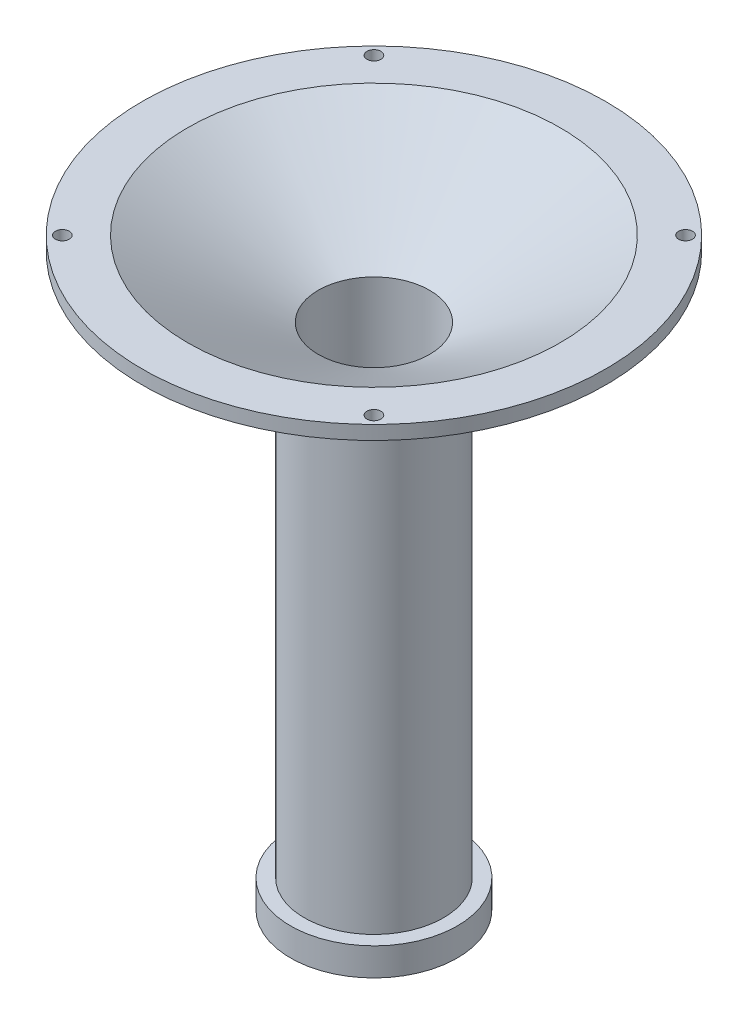
ISO-10303-21;
HEADER;
FILE_DESCRIPTION(('STEP AP214'),'2;1');
FILE_NAME('part.step','',(''),(''),'','','');
FILE_SCHEMA(('AUTOMOTIVE_DESIGN { 1 0 10303 214 1 1 1 1 }'));
ENDSEC;
DATA;
#1=APPLICATION_CONTEXT('core data for automotive mechanical design processes');
#2=APPLICATION_PROTOCOL_DEFINITION('international standard','automotive_design',2000,#1);
#3=PRODUCT_CONTEXT('',#1,'mechanical');
#4=PRODUCT('Part','Part','',(#3));
#5=PRODUCT_RELATED_PRODUCT_CATEGORY('part','',(#4));
#6=PRODUCT_DEFINITION_FORMATION('','',#4);
#7=PRODUCT_DEFINITION_CONTEXT('part definition',#1,'design');
#8=PRODUCT_DEFINITION('design','',#6,#7);
#9=PRODUCT_DEFINITION_SHAPE('','',#8);
#10=(LENGTH_UNIT() NAMED_UNIT(*) SI_UNIT(.MILLI.,.METRE.));
#11=(NAMED_UNIT(*) PLANE_ANGLE_UNIT() SI_UNIT($,.RADIAN.));
#12=(NAMED_UNIT(*) SI_UNIT($,.STERADIAN.) SOLID_ANGLE_UNIT());
#13=UNCERTAINTY_MEASURE_WITH_UNIT(LENGTH_MEASURE(1.E-05),#10,'distance_accuracy_value','');
#14=(GEOMETRIC_REPRESENTATION_CONTEXT(3) GLOBAL_UNCERTAINTY_ASSIGNED_CONTEXT((#13)) GLOBAL_UNIT_ASSIGNED_CONTEXT((#10,
#11,#12)) REPRESENTATION_CONTEXT('',''));
#15=CARTESIAN_POINT('',(0.,0.,0.));
#16=DIRECTION('',(0.,0.,1.));
#17=DIRECTION('',(1.,0.,0.));
#18=AXIS2_PLACEMENT_3D('',#15,#16,#17);
#19=CARTESIAN_POINT('',(0.,0.,0.));
#20=DIRECTION('',(0.,-1.,0.));
#21=DIRECTION('',(0.,0.,-1.));
#22=AXIS2_PLACEMENT_3D('',#19,#20,#21);
#23=CYLINDRICAL_SURFACE('',#22,20.);
#24=CARTESIAN_POINT('',(0.,-121.747729767954,0.));
#25=DIRECTION('',(0.,-1.,0.));
#26=DIRECTION('',(0.,0.,-1.));
#27=AXIS2_PLACEMENT_3D('',#24,#25,#26);
#28=CIRCLE('',#27,20.);
#29=CARTESIAN_POINT('',(0.,-121.747729767954,-20.));
#30=VERTEX_POINT('',#29);
#31=EDGE_CURVE('E10',#30,#30,#28,.T.);
#32=ORIENTED_EDGE('',*,*,#31,.T.);
#33=EDGE_LOOP('',(#32));
#34=FACE_BOUND('',#33,.T.);
#35=CARTESIAN_POINT('',(0.,61.1390215779937,0.));
#36=DIRECTION('',(0.,-1.,0.));
#37=DIRECTION('',(0.,0.,-1.));
#38=AXIS2_PLACEMENT_3D('',#35,#36,#37);
#39=CIRCLE('',#38,20.);
#40=CARTESIAN_POINT('',(0.,61.1390215779937,20.));
#41=VERTEX_POINT('',#40);
#42=EDGE_CURVE('E39',#41,#41,#39,.T.);
#43=ORIENTED_EDGE('',*,*,#42,.F.);
#44=EDGE_LOOP('',(#43));
#45=FACE_BOUND('',#44,.T.);
#46=ADVANCED_FACE('F33',(#34,#45),#23,.F.);
#47=CARTESIAN_POINT('',(0.,88.2522702320456,0.));
#48=DIRECTION('',(0.,1.,0.));
#49=DIRECTION('',(0.,0.,1.));
#50=AXIS2_PLACEMENT_3D('',#47,#48,#49);
#51=CONICAL_SURFACE('',#50,66.9615242270664,1.0471975511966);
#52=CARTESIAN_POINT('',(0.,88.2522702320456,0.));
#53=DIRECTION('',(0.,-1.,0.));
#54=DIRECTION('',(0.,0.,-1.));
#55=AXIS2_PLACEMENT_3D('',#52,#53,#54);
#56=CIRCLE('',#55,66.9615242270664);
#57=CARTESIAN_POINT('',(0.,88.2522702320456,66.9615242270665));
#58=VERTEX_POINT('',#57);
#59=EDGE_CURVE('E43',#58,#58,#56,.T.);
#60=CARTESIAN_POINT('',(0.,61.1390215779937,20.));
#61=CARTESIAN_POINT('',(0.,61.4214512514734,20.4891825440319));
#62=CARTESIAN_POINT('',(0.,61.7038809249532,20.9783650880639));
#63=CARTESIAN_POINT('',(0.,62.2687402719126,21.9567301761278));
#64=CARTESIAN_POINT('',(0.,62.5511699453923,22.4459127201597));
#65=CARTESIAN_POINT('',(0.,63.1160292923517,23.4242778082236));
#66=CARTESIAN_POINT('',(0.,63.3984589658314,23.9134603522555));
#67=CARTESIAN_POINT('',(0.,63.9633183127908,24.8918254403194));
#68=CARTESIAN_POINT('',(0.,64.2457479862705,25.3810079843514));
#69=CARTESIAN_POINT('',(0.,64.8106073332299,26.3593730724152));
#70=CARTESIAN_POINT('',(0.,65.0930370067096,26.8485556164472));
#71=CARTESIAN_POINT('',(0.,65.657896353669,27.8269207045111));
#72=CARTESIAN_POINT('',(0.,65.9403260271488,28.316103248543));
#73=CARTESIAN_POINT('',(0.,66.5051853741082,29.2944683366069));
#74=CARTESIAN_POINT('',(0.,66.7876150475879,29.7836508806388));
#75=CARTESIAN_POINT('',(0.,67.3524743945473,30.7620159687027));
#76=CARTESIAN_POINT('',(0.,67.634904068027,31.2511985127347));
#77=CARTESIAN_POINT('',(0.,68.1997634149864,32.2295636007985));
#78=CARTESIAN_POINT('',(0.,68.4821930884661,32.7187461448305));
#79=CARTESIAN_POINT('',(0.,69.0470524354255,33.6971112328944));
#80=CARTESIAN_POINT('',(0.,69.3294821089052,34.1862937769263));
#81=CARTESIAN_POINT('',(0.,69.8943414558646,35.1646588649902));
#82=CARTESIAN_POINT('',(0.,70.1767711293444,35.6538414090221));
#83=CARTESIAN_POINT('',(0.,70.7416304763038,36.632206497086));
#84=CARTESIAN_POINT('',(0.,71.0240601497835,37.121389041118));
#85=CARTESIAN_POINT('',(0.,71.5889194967429,38.0997541291819));
#86=CARTESIAN_POINT('',(0.,71.8713491702226,38.5889366732138));
#87=CARTESIAN_POINT('',(0.,72.436208517182,39.5673017612777));
#88=CARTESIAN_POINT('',(0.,72.7186381906617,40.0564843053096));
#89=CARTESIAN_POINT('',(0.,73.2834975376211,41.0348493933735));
#90=CARTESIAN_POINT('',(0.,73.5659272111008,41.5240319374055));
#91=CARTESIAN_POINT('',(0.,74.1307865580603,42.5023970254693));
#92=CARTESIAN_POINT('',(0.,74.41321623154,42.9915795695013));
#93=CARTESIAN_POINT('',(0.,74.9780755784994,43.9699446575652));
#94=CARTESIAN_POINT('',(0.,75.2605052519791,44.4591272015971));
#95=CARTESIAN_POINT('',(0.,75.8253645989385,45.437492289661));
#96=CARTESIAN_POINT('',(0.,76.1077942724182,45.9266748336929));
#97=CARTESIAN_POINT('',(0.,76.6726536193776,46.9050399217568));
#98=CARTESIAN_POINT('',(0.,76.9550832928573,47.3942224657888));
#99=CARTESIAN_POINT('',(0.,77.5199426398167,48.3725875538526));
#100=CARTESIAN_POINT('',(0.,77.8023723132965,48.8617700978846));
#101=CARTESIAN_POINT('',(0.,78.3672316602559,49.8401351859485));
#102=CARTESIAN_POINT('',(0.,78.6496613337356,50.3293177299804));
#103=CARTESIAN_POINT('',(0.,79.214520680695,51.3076828180443));
#104=CARTESIAN_POINT('',(0.,79.4969503541747,51.7968653620762));
#105=CARTESIAN_POINT('',(0.,80.0618097011341,52.7752304501401));
#106=CARTESIAN_POINT('',(0.,80.3442393746138,53.2644129941721));
#107=CARTESIAN_POINT('',(0.,80.9090987215732,54.242778082236));
#108=CARTESIAN_POINT('',(0.,81.1915283950529,54.7319606262679));
#109=CARTESIAN_POINT('',(0.,81.7563877420123,55.7103257143318));
#110=CARTESIAN_POINT('',(0.,82.0388174154921,56.1995082583637));
#111=CARTESIAN_POINT('',(0.,82.6036767624515,57.1778733464276));
#112=CARTESIAN_POINT('',(0.,82.8861064359312,57.6670558904596));
#113=CARTESIAN_POINT('',(0.,83.4509657828906,58.6454209785234));
#114=CARTESIAN_POINT('',(0.,83.7333954563703,59.1346035225554));
#115=CARTESIAN_POINT('',(0.,84.2982548033297,60.1129686106193));
#116=CARTESIAN_POINT('',(0.,84.5806844768094,60.6021511546512));
#117=CARTESIAN_POINT('',(0.,85.1455438237688,61.5805162427151));
#118=CARTESIAN_POINT('',(0.,85.4279734972485,62.069698786747));
#119=CARTESIAN_POINT('',(0.,85.9928328442079,63.0480638748109));
#120=CARTESIAN_POINT('',(0.,86.2752625176877,63.5372464188429));
#121=CARTESIAN_POINT('',(0.,86.8401218646471,64.5156115069067));
#122=CARTESIAN_POINT('',(0.,87.1225515381268,65.0047940509387));
#123=CARTESIAN_POINT('',(0.,87.6874108850862,65.9831591390026));
#124=CARTESIAN_POINT('',(0.,87.9698405585659,66.4723416830345));
#125=CARTESIAN_POINT('',(0.,88.2522702320456,66.9615242270665));
#126=B_SPLINE_CURVE_WITH_KNOTS('',3,(#60,#61,#62,#63,#64,#65,#66,#67,#68,#69,#70,#71,#72,#73,
#74,#75,#76,#77,#78,#79,#80,#81,#82,#83,#84,#85,#86,#87,#88,#89,#90,#91,#92,#93,#94,#95,#96,#97,
#98,#99,#100,#101,#102,#103,#104,#105,#106,#107,#108,#109,#110,#111,#112,#113,#114,#115,#116,
#117,#118,#119,#120,#121,#122,#123,#124,#125),.UNSPECIFIED.,.F.,.F.,(4,2,2,2,2,2,2,2,2,2,2,2,2,
2,2,2,2,2,2,2,2,2,2,2,2,2,2,2,2,2,2,2,4),(0.,1.69457804087824,3.38915608175649,5.08373412263473,
6.77831216351297,8.47289020439123,10.1674682452695,11.8620462861477,13.556624327026,
15.2512023679042,16.9457804087825,18.6403584496607,20.334936490539,22.0295145314172,
23.7240925722954,25.4186706131737,27.1132486540519,28.8078266949302,30.5024047358084,
32.1969827766867,33.8915608175649,35.5861388584432,37.2807168993214,38.9752949401996,
40.6698729810779,42.3644510219561,44.0590290628344,45.7536071037126,47.4481851445909,
49.1427631854691,50.8373412263474,52.5319192672256,54.2264973081039),.UNSPECIFIED.);
#127=EDGE_CURVE('BSEAM101',#41,#58,#126,.T.);
#128=ORIENTED_EDGE('',*,*,#42,.T.);
#129=ORIENTED_EDGE('',*,*,#59,.F.);
#130=ORIENTED_EDGE('',*,*,#127,.T.);
#131=ORIENTED_EDGE('',*,*,#127,.F.);
#132=EDGE_LOOP('',(#128,#130,#129,#131));
#133=FACE_BOUND('',#132,.T.);
#134=ADVANCED_FACE('F101',(#133),#51,.F.);
#135=CARTESIAN_POINT('',(83.3012701892221,88.2522702320456,0.));
#136=DIRECTION('',(0.,1.,0.));
#137=DIRECTION('',(0.,0.,1.));
#138=AXIS2_PLACEMENT_3D('',#135,#136,#137);
#139=PLANE('',#138);
#140=CARTESIAN_POINT('',(-56.,88.2522702320456,-56.));
#141=DIRECTION('',(0.,1.,0.));
#142=DIRECTION('',(0.,0.,1.));
#143=AXIS2_PLACEMENT_3D('',#140,#141,#142);
#144=CIRCLE('',#143,2.49999999999999);
#145=CARTESIAN_POINT('',(-56.,88.2522702320456,-53.5));
#146=VERTEX_POINT('',#145);
#147=EDGE_CURVE('E91',#146,#146,#144,.T.);
#148=ORIENTED_EDGE('',*,*,#147,.F.);
#149=EDGE_LOOP('',(#148));
#150=FACE_BOUND('',#149,.T.);
#151=CARTESIAN_POINT('',(56.,88.2522702320456,-56.));
#152=DIRECTION('',(0.,1.,0.));
#153=DIRECTION('',(0.,0.,1.));
#154=AXIS2_PLACEMENT_3D('',#151,#152,#153);
#155=CIRCLE('',#154,2.49999999999999);
#156=CARTESIAN_POINT('',(56.,88.2522702320456,-53.5));
#157=VERTEX_POINT('',#156);
#158=EDGE_CURVE('E85',#157,#157,#155,.T.);
#159=ORIENTED_EDGE('',*,*,#158,.F.);
#160=EDGE_LOOP('',(#159));
#161=FACE_BOUND('',#160,.T.);
#162=CARTESIAN_POINT('',(-56.,88.2522702320456,56.));
#163=DIRECTION('',(0.,1.,0.));
#164=DIRECTION('',(0.,0.,1.));
#165=AXIS2_PLACEMENT_3D('',#162,#163,#164);
#166=CIRCLE('',#165,2.49999999999999);
#167=CARTESIAN_POINT('',(-56.,88.2522702320456,58.5));
#168=VERTEX_POINT('',#167);
#169=EDGE_CURVE('E79',#168,#168,#166,.T.);
#170=ORIENTED_EDGE('',*,*,#169,.F.);
#171=EDGE_LOOP('',(#170));
#172=FACE_BOUND('',#171,.T.);
#173=CARTESIAN_POINT('',(56.,88.2522702320456,56.));
#174=DIRECTION('',(0.,1.,0.));
#175=DIRECTION('',(0.,0.,1.));
#176=AXIS2_PLACEMENT_3D('',#173,#174,#175);
#177=CIRCLE('',#176,2.49999999999999);
#178=CARTESIAN_POINT('',(56.,88.2522702320456,58.5));
#179=VERTEX_POINT('',#178);
#180=EDGE_CURVE('E73',#179,#179,#177,.T.);
#181=ORIENTED_EDGE('',*,*,#180,.F.);
#182=EDGE_LOOP('',(#181));
#183=FACE_BOUND('',#182,.T.);
#184=ORIENTED_EDGE('',*,*,#59,.T.);
#185=EDGE_LOOP('',(#184));
#186=FACE_BOUND('',#185,.T.);
#187=CARTESIAN_POINT('',(0.,88.2522702320456,0.));
#188=DIRECTION('',(0.,-1.,0.));
#189=DIRECTION('',(0.,0.,-1.));
#190=AXIS2_PLACEMENT_3D('',#187,#188,#189);
#191=CIRCLE('',#190,83.3012701892221);
#192=CARTESIAN_POINT('',(0.,88.2522702320456,-83.3012701892221));
#193=VERTEX_POINT('',#192);
#194=EDGE_CURVE('E47',#193,#193,#191,.T.);
#195=ORIENTED_EDGE('',*,*,#194,.F.);
#196=EDGE_LOOP('',(#195));
#197=FACE_BOUND('',#196,.T.);
#198=ADVANCED_FACE('F97',(#150,#161,#172,#183,#186,#197),#139,.T.);
#199=CARTESIAN_POINT('',(0.,0.,0.));
#200=DIRECTION('',(0.,-1.,0.));
#201=DIRECTION('',(0.,0.,-1.));
#202=AXIS2_PLACEMENT_3D('',#199,#200,#201);
#203=CYLINDRICAL_SURFACE('',#202,83.3012701892221);
#204=ORIENTED_EDGE('',*,*,#194,.T.);
#205=EDGE_LOOP('',(#204));
#206=FACE_BOUND('',#205,.T.);
#207=CARTESIAN_POINT('',(0.,83.2522702320456,0.));
#208=DIRECTION('',(0.,-1.,0.));
#209=DIRECTION('',(0.,0.,-1.));
#210=AXIS2_PLACEMENT_3D('',#207,#208,#209);
#211=CIRCLE('',#210,83.3012701892221);
#212=CARTESIAN_POINT('',(0.,83.2522702320456,-83.3012701892221));
#213=VERTEX_POINT('',#212);
#214=EDGE_CURVE('E52',#213,#213,#211,.T.);
#215=ORIENTED_EDGE('',*,*,#214,.F.);
#216=EDGE_LOOP('',(#215));
#217=FACE_BOUND('',#216,.T.);
#218=ADVANCED_FACE('F100',(#206,#217),#203,.T.);
#219=CARTESIAN_POINT('',(68.3012701892221,83.2522702320456,0.));
#220=DIRECTION('',(0.,-1.,0.));
#221=DIRECTION('',(0.,0.,-1.));
#222=AXIS2_PLACEMENT_3D('',#219,#220,#221);
#223=PLANE('',#222);
#224=CARTESIAN_POINT('',(-56.,83.2522702320456,-56.));
#225=DIRECTION('',(0.,-1.,0.));
#226=DIRECTION('',(0.,0.,-1.));
#227=AXIS2_PLACEMENT_3D('',#224,#225,#226);
#228=CIRCLE('',#227,2.49999999999997);
#229=CARTESIAN_POINT('',(-56.,83.2522702320456,-58.5));
#230=VERTEX_POINT('',#229);
#231=EDGE_CURVE('E88',#230,#230,#228,.T.);
#232=ORIENTED_EDGE('',*,*,#231,.F.);
#233=EDGE_LOOP('',(#232));
#234=FACE_BOUND('',#233,.T.);
#235=CARTESIAN_POINT('',(56.,83.2522702320456,-56.));
#236=DIRECTION('',(0.,-1.,0.));
#237=DIRECTION('',(0.,0.,-1.));
#238=AXIS2_PLACEMENT_3D('',#235,#236,#237);
#239=CIRCLE('',#238,2.49999999999997);
#240=CARTESIAN_POINT('',(56.,83.2522702320456,-58.5));
#241=VERTEX_POINT('',#240);
#242=EDGE_CURVE('E82',#241,#241,#239,.T.);
#243=ORIENTED_EDGE('',*,*,#242,.F.);
#244=EDGE_LOOP('',(#243));
#245=FACE_BOUND('',#244,.T.);
#246=CARTESIAN_POINT('',(-56.,83.2522702320456,56.));
#247=DIRECTION('',(0.,-1.,0.));
#248=DIRECTION('',(0.,0.,-1.));
#249=AXIS2_PLACEMENT_3D('',#246,#247,#248);
#250=CIRCLE('',#249,2.49999999999997);
#251=CARTESIAN_POINT('',(-56.,83.2522702320456,53.5));
#252=VERTEX_POINT('',#251);
#253=EDGE_CURVE('E76',#252,#252,#250,.T.);
#254=ORIENTED_EDGE('',*,*,#253,.F.);
#255=EDGE_LOOP('',(#254));
#256=FACE_BOUND('',#255,.T.);
#257=CARTESIAN_POINT('',(56.,83.2522702320456,56.));
#258=DIRECTION('',(0.,-1.,0.));
#259=DIRECTION('',(0.,0.,-1.));
#260=AXIS2_PLACEMENT_3D('',#257,#258,#259);
#261=CIRCLE('',#260,2.49999999999997);
#262=CARTESIAN_POINT('',(56.,83.2522702320456,53.5));
#263=VERTEX_POINT('',#262);
#264=EDGE_CURVE('E70',#263,#263,#261,.T.);
#265=ORIENTED_EDGE('',*,*,#264,.F.);
#266=EDGE_LOOP('',(#265));
#267=FACE_BOUND('',#266,.T.);
#268=ORIENTED_EDGE('',*,*,#214,.T.);
#269=EDGE_LOOP('',(#268));
#270=FACE_BOUND('',#269,.T.);
#271=CARTESIAN_POINT('',(0.,83.2522702320456,0.));
#272=DIRECTION('',(0.,-1.,0.));
#273=DIRECTION('',(0.,0.,-1.));
#274=AXIS2_PLACEMENT_3D('',#271,#272,#273);
#275=CIRCLE('',#274,68.3012701892221);
#276=CARTESIAN_POINT('',(0.,83.2522702320456,-68.3012701892221));
#277=VERTEX_POINT('',#276);
#278=EDGE_CURVE('E55',#277,#277,#275,.T.);
#279=ORIENTED_EDGE('',*,*,#278,.F.);
#280=EDGE_LOOP('',(#279));
#281=FACE_BOUND('',#280,.T.);
#282=ADVANCED_FACE('F115',(#234,#245,#256,#267,#270,#281),#223,.T.);
#283=CARTESIAN_POINT('',(0.,58.2522702320456,0.));
#284=DIRECTION('',(0.,1.,0.));
#285=DIRECTION('',(0.,0.,1.));
#286=AXIS2_PLACEMENT_3D('',#283,#284,#285);
#287=CONICAL_SURFACE('',#286,25.,1.0471975511966);
#288=ORIENTED_EDGE('',*,*,#278,.T.);
#289=EDGE_LOOP('',(#288));
#290=FACE_BOUND('',#289,.T.);
#291=CARTESIAN_POINT('',(0.,58.2522702320456,0.));
#292=DIRECTION('',(0.,-1.,0.));
#293=DIRECTION('',(0.,0.,-1.));
#294=AXIS2_PLACEMENT_3D('',#291,#292,#293);
#295=CIRCLE('',#294,25.);
#296=CARTESIAN_POINT('',(0.,58.2522702320456,-25.));
#297=VERTEX_POINT('',#296);
#298=EDGE_CURVE('E58',#297,#297,#295,.T.);
#299=ORIENTED_EDGE('',*,*,#298,.F.);
#300=EDGE_LOOP('',(#299));
#301=FACE_BOUND('',#300,.T.);
#302=ADVANCED_FACE('F121',(#290,#301),#287,.T.);
#303=CARTESIAN_POINT('',(0.,0.,0.));
#304=DIRECTION('',(0.,-1.,0.));
#305=DIRECTION('',(0.,0.,-1.));
#306=AXIS2_PLACEMENT_3D('',#303,#304,#305);
#307=CYLINDRICAL_SURFACE('',#306,25.);
#308=ORIENTED_EDGE('',*,*,#298,.T.);
#309=EDGE_LOOP('',(#308));
#310=FACE_BOUND('',#309,.T.);
#311=CARTESIAN_POINT('',(0.,-111.747729767954,0.));
#312=DIRECTION('',(0.,-1.,0.));
#313=DIRECTION('',(0.,0.,-1.));
#314=AXIS2_PLACEMENT_3D('',#311,#312,#313);
#315=CIRCLE('',#314,25.);
#316=CARTESIAN_POINT('',(0.,-111.747729767954,-25.));
#317=VERTEX_POINT('',#316);
#318=EDGE_CURVE('E61',#317,#317,#315,.T.);
#319=ORIENTED_EDGE('',*,*,#318,.F.);
#320=EDGE_LOOP('',(#319));
#321=FACE_BOUND('',#320,.T.);
#322=ADVANCED_FACE('F128',(#310,#321),#307,.T.);
#323=CARTESIAN_POINT('',(30.,-111.747729767954,0.));
#324=DIRECTION('',(0.,1.,0.));
#325=DIRECTION('',(0.,0.,1.));
#326=AXIS2_PLACEMENT_3D('',#323,#324,#325);
#327=PLANE('',#326);
#328=ORIENTED_EDGE('',*,*,#318,.T.);
#329=EDGE_LOOP('',(#328));
#330=FACE_BOUND('',#329,.T.);
#331=CARTESIAN_POINT('',(0.,-111.747729767954,0.));
#332=DIRECTION('',(0.,-1.,0.));
#333=DIRECTION('',(0.,0.,-1.));
#334=AXIS2_PLACEMENT_3D('',#331,#332,#333);
#335=CIRCLE('',#334,30.);
#336=CARTESIAN_POINT('',(0.,-111.747729767954,-30.));
#337=VERTEX_POINT('',#336);
#338=EDGE_CURVE('E64',#337,#337,#335,.T.);
#339=ORIENTED_EDGE('',*,*,#338,.F.);
#340=EDGE_LOOP('',(#339));
#341=FACE_BOUND('',#340,.T.);
#342=ADVANCED_FACE('F134',(#330,#341),#327,.T.);
#343=CARTESIAN_POINT('',(0.,0.,0.));
#344=DIRECTION('',(0.,-1.,0.));
#345=DIRECTION('',(0.,0.,-1.));
#346=AXIS2_PLACEMENT_3D('',#343,#344,#345);
#347=CYLINDRICAL_SURFACE('',#346,30.);
#348=ORIENTED_EDGE('',*,*,#338,.T.);
#349=EDGE_LOOP('',(#348));
#350=FACE_BOUND('',#349,.T.);
#351=CARTESIAN_POINT('',(0.,-121.747729767954,0.));
#352=DIRECTION('',(0.,-1.,0.));
#353=DIRECTION('',(0.,0.,-1.));
#354=AXIS2_PLACEMENT_3D('',#351,#352,#353);
#355=CIRCLE('',#354,30.);
#356=CARTESIAN_POINT('',(0.,-121.747729767954,-30.));
#357=VERTEX_POINT('',#356);
#358=EDGE_CURVE('E67',#357,#357,#355,.T.);
#359=ORIENTED_EDGE('',*,*,#358,.F.);
#360=EDGE_LOOP('',(#359));
#361=FACE_BOUND('',#360,.T.);
#362=ADVANCED_FACE('F140',(#350,#361),#347,.T.);
#363=CARTESIAN_POINT('',(25.,-121.747729767954,0.));
#364=DIRECTION('',(0.,-1.,0.));
#365=DIRECTION('',(0.,0.,-1.));
#366=AXIS2_PLACEMENT_3D('',#363,#364,#365);
#367=PLANE('',#366);
#368=ORIENTED_EDGE('',*,*,#358,.T.);
#369=EDGE_LOOP('',(#368));
#370=FACE_BOUND('',#369,.T.);
#371=ORIENTED_EDGE('',*,*,#31,.F.);
#372=EDGE_LOOP('',(#371));
#373=FACE_BOUND('',#372,.T.);
#374=ADVANCED_FACE('F146',(#370,#373),#367,.T.);
#375=CARTESIAN_POINT('',(56.,88.2522702320456,56.));
#376=DIRECTION('',(0.,1.,0.));
#377=DIRECTION('',(0.,0.,1.));
#378=AXIS2_PLACEMENT_3D('',#375,#376,#377);
#379=CYLINDRICAL_SURFACE('',#378,2.49999999999997);
#380=ORIENTED_EDGE('',*,*,#264,.T.);
#381=EDGE_LOOP('',(#380));
#382=FACE_BOUND('',#381,.T.);
#383=ORIENTED_EDGE('',*,*,#180,.T.);
#384=EDGE_LOOP('',(#383));
#385=FACE_BOUND('',#384,.T.);
#386=ADVANCED_FACE('F152',(#382,#385),#379,.F.);
#387=CARTESIAN_POINT('',(-56.,88.2522702320456,56.));
#388=DIRECTION('',(0.,1.,0.));
#389=DIRECTION('',(0.,0.,1.));
#390=AXIS2_PLACEMENT_3D('',#387,#388,#389);
#391=CYLINDRICAL_SURFACE('',#390,2.49999999999997);
#392=ORIENTED_EDGE('',*,*,#253,.T.);
#393=EDGE_LOOP('',(#392));
#394=FACE_BOUND('',#393,.T.);
#395=ORIENTED_EDGE('',*,*,#169,.T.);
#396=EDGE_LOOP('',(#395));
#397=FACE_BOUND('',#396,.T.);
#398=ADVANCED_FACE('F157',(#394,#397),#391,.F.);
#399=CARTESIAN_POINT('',(56.,88.2522702320456,-56.));
#400=DIRECTION('',(0.,1.,0.));
#401=DIRECTION('',(0.,0.,1.));
#402=AXIS2_PLACEMENT_3D('',#399,#400,#401);
#403=CYLINDRICAL_SURFACE('',#402,2.49999999999997);
#404=ORIENTED_EDGE('',*,*,#242,.T.);
#405=EDGE_LOOP('',(#404));
#406=FACE_BOUND('',#405,.T.);
#407=ORIENTED_EDGE('',*,*,#158,.T.);
#408=EDGE_LOOP('',(#407));
#409=FACE_BOUND('',#408,.T.);
#410=ADVANCED_FACE('F218',(#406,#409),#403,.F.);
#411=CARTESIAN_POINT('',(-56.,88.2522702320456,-56.));
#412=DIRECTION('',(0.,1.,0.));
#413=DIRECTION('',(0.,0.,1.));
#414=AXIS2_PLACEMENT_3D('',#411,#412,#413);
#415=CYLINDRICAL_SURFACE('',#414,2.49999999999997);
#416=ORIENTED_EDGE('',*,*,#231,.T.);
#417=EDGE_LOOP('',(#416));
#418=FACE_BOUND('',#417,.T.);
#419=ORIENTED_EDGE('',*,*,#147,.T.);
#420=EDGE_LOOP('',(#419));
#421=FACE_BOUND('',#420,.T.);
#422=ADVANCED_FACE('F95',(#418,#421),#415,.F.);
#423=CLOSED_SHELL('',(#46,#134,#198,#218,#282,#302,#322,#342,#362,#374,#386,#398,#410,#422));
#424=MANIFOLD_SOLID_BREP('B2',#423);
#425=ADVANCED_BREP_SHAPE_REPRESENTATION('',(#18,#424),#14);
#426=SHAPE_DEFINITION_REPRESENTATION(#9,#425);
ENDSEC;
END-ISO-10303-21;
